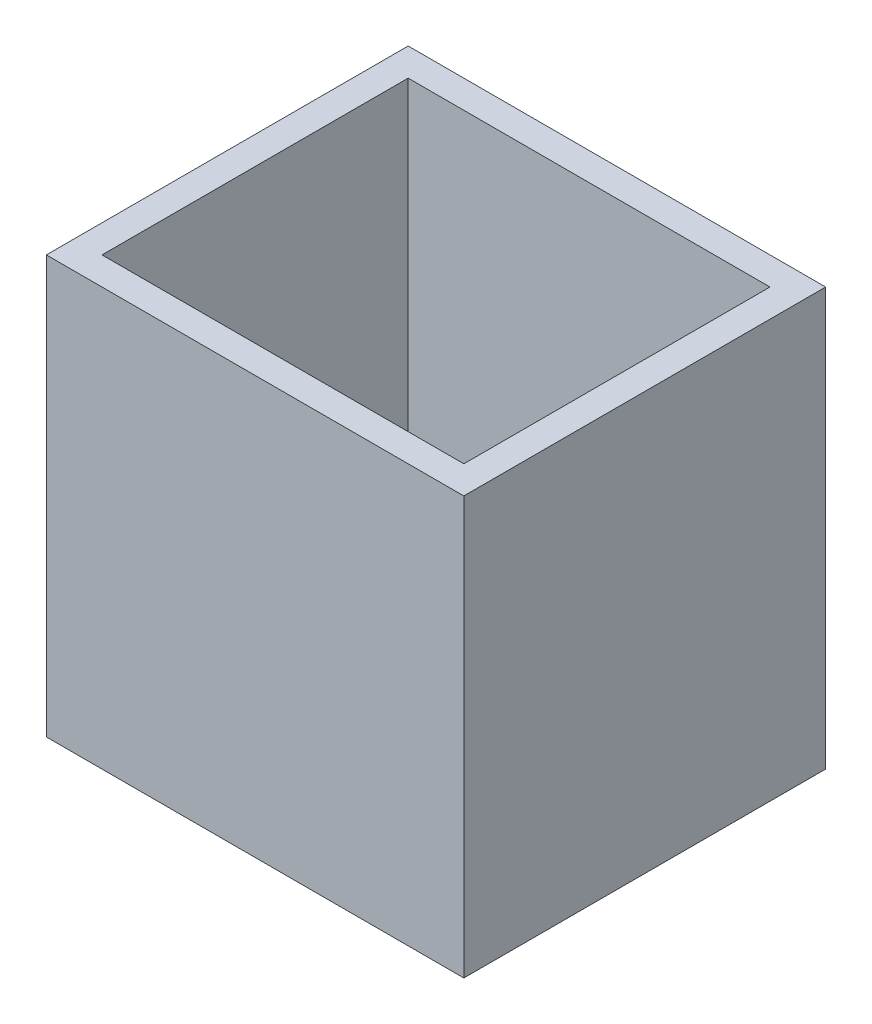
ISO-10303-21;
HEADER;
FILE_DESCRIPTION(('STEP AP214'),'2;1');
FILE_NAME('part.step','',(''),(''),'','','');
FILE_SCHEMA(('AUTOMOTIVE_DESIGN { 1 0 10303 214 1 1 1 1 }'));
ENDSEC;
DATA;
#1=APPLICATION_CONTEXT('core data for automotive mechanical design processes');
#2=APPLICATION_PROTOCOL_DEFINITION('international standard','automotive_design',2000,#1);
#3=PRODUCT_CONTEXT('',#1,'mechanical');
#4=PRODUCT('Part','Part','',(#3));
#5=PRODUCT_RELATED_PRODUCT_CATEGORY('part','',(#4));
#6=PRODUCT_DEFINITION_FORMATION('','',#4);
#7=PRODUCT_DEFINITION_CONTEXT('part definition',#1,'design');
#8=PRODUCT_DEFINITION('design','',#6,#7);
#9=PRODUCT_DEFINITION_SHAPE('','',#8);
#10=(LENGTH_UNIT() NAMED_UNIT(*) SI_UNIT(.MILLI.,.METRE.));
#11=(NAMED_UNIT(*) PLANE_ANGLE_UNIT() SI_UNIT($,.RADIAN.));
#12=(NAMED_UNIT(*) SI_UNIT($,.STERADIAN.) SOLID_ANGLE_UNIT());
#13=UNCERTAINTY_MEASURE_WITH_UNIT(LENGTH_MEASURE(1.E-05),#10,'distance_accuracy_value','');
#14=(GEOMETRIC_REPRESENTATION_CONTEXT(3) GLOBAL_UNCERTAINTY_ASSIGNED_CONTEXT((#13)) GLOBAL_UNIT_ASSIGNED_CONTEXT((#10,
#11,#12)) REPRESENTATION_CONTEXT('',''));
#15=CARTESIAN_POINT('',(0.,0.,0.));
#16=DIRECTION('',(0.,0.,1.));
#17=DIRECTION('',(1.,0.,0.));
#18=AXIS2_PLACEMENT_3D('',#15,#16,#17);
#19=CARTESIAN_POINT('',(0.,0.,130.));
#20=DIRECTION('',(1.,0.,0.));
#21=DIRECTION('',(0.,0.,-1.));
#22=AXIS2_PLACEMENT_3D('',#19,#20,#21);
#23=PLANE('',#22);
#24=DIRECTION('',(0.,-1.,0.));
#25=VECTOR('',#24,1.);
#26=CARTESIAN_POINT('',(0.,0.,0.));
#27=LINE('',#26,#25);
#28=CARTESIAN_POINT('',(0.,150.,0.));
#29=VERTEX_POINT('',#28);
#30=CARTESIAN_POINT('',(0.,0.,0.));
#31=VERTEX_POINT('',#30);
#32=EDGE_CURVE('E164',#29,#31,#27,.T.);
#33=ORIENTED_EDGE('',*,*,#32,.T.);
#34=DIRECTION('',(0.,0.,-1.));
#35=VECTOR('',#34,1.);
#36=CARTESIAN_POINT('',(0.,0.,130.));
#37=LINE('',#36,#35);
#38=CARTESIAN_POINT('',(0.,0.,130.));
#39=VERTEX_POINT('',#38);
#40=EDGE_CURVE('E11',#39,#31,#37,.T.);
#41=ORIENTED_EDGE('',*,*,#40,.F.);
#42=DIRECTION('',(0.,-1.,0.));
#43=VECTOR('',#42,1.);
#44=CARTESIAN_POINT('',(0.,0.,130.));
#45=LINE('',#44,#43);
#46=CARTESIAN_POINT('',(0.,150.,130.));
#47=VERTEX_POINT('',#46);
#48=EDGE_CURVE('E170',#47,#39,#45,.T.);
#49=ORIENTED_EDGE('',*,*,#48,.F.);
#50=DIRECTION('',(0.,0.,-1.));
#51=VECTOR('',#50,1.);
#52=CARTESIAN_POINT('',(0.,150.,130.));
#53=LINE('',#52,#51);
#54=EDGE_CURVE('E180',#47,#29,#53,.T.);
#55=ORIENTED_EDGE('',*,*,#54,.T.);
#56=EDGE_LOOP('',(#33,#41,#49,#55));
#57=FACE_BOUND('',#56,.T.);
#58=ADVANCED_FACE('F45',(#57),#23,.F.);
#59=CARTESIAN_POINT('',(0.,0.,130.));
#60=DIRECTION('',(0.,1.,0.));
#61=DIRECTION('',(0.,0.,1.));
#62=AXIS2_PLACEMENT_3D('',#59,#60,#61);
#63=PLANE('',#62);
#64=DIRECTION('',(1.,0.,0.));
#65=VECTOR('',#64,1.);
#66=CARTESIAN_POINT('',(0.,0.,0.));
#67=LINE('',#66,#65);
#68=CARTESIAN_POINT('',(150.,0.,0.));
#69=VERTEX_POINT('',#68);
#70=EDGE_CURVE('E184',#31,#69,#67,.T.);
#71=ORIENTED_EDGE('',*,*,#70,.T.);
#72=DIRECTION('',(0.,0.,-1.));
#73=VECTOR('',#72,1.);
#74=CARTESIAN_POINT('',(150.,0.,130.));
#75=LINE('',#74,#73);
#76=CARTESIAN_POINT('',(150.,0.,130.));
#77=VERTEX_POINT('',#76);
#78=EDGE_CURVE('E53',#77,#69,#75,.T.);
#79=ORIENTED_EDGE('',*,*,#78,.F.);
#80=DIRECTION('',(1.,0.,0.));
#81=VECTOR('',#80,1.);
#82=CARTESIAN_POINT('',(0.,0.,130.));
#83=LINE('',#82,#81);
#84=EDGE_CURVE('E97',#39,#77,#83,.T.);
#85=ORIENTED_EDGE('',*,*,#84,.F.);
#86=ORIENTED_EDGE('',*,*,#40,.T.);
#87=EDGE_LOOP('',(#71,#79,#85,#86));
#88=FACE_BOUND('',#87,.T.);
#89=ADVANCED_FACE('F221',(#88),#63,.F.);
#90=CARTESIAN_POINT('',(150.,0.,130.));
#91=DIRECTION('',(-1.,0.,0.));
#92=DIRECTION('',(0.,0.,1.));
#93=AXIS2_PLACEMENT_3D('',#90,#91,#92);
#94=PLANE('',#93);
#95=DIRECTION('',(0.,1.,0.));
#96=VECTOR('',#95,1.);
#97=CARTESIAN_POINT('',(150.,0.,0.));
#98=LINE('',#97,#96);
#99=CARTESIAN_POINT('',(150.,150.,0.));
#100=VERTEX_POINT('',#99);
#101=EDGE_CURVE('E187',#69,#100,#98,.T.);
#102=ORIENTED_EDGE('',*,*,#101,.T.);
#103=DIRECTION('',(0.,0.,-1.));
#104=VECTOR('',#103,1.);
#105=CARTESIAN_POINT('',(150.,150.,130.));
#106=LINE('',#105,#104);
#107=CARTESIAN_POINT('',(150.,150.,130.));
#108=VERTEX_POINT('',#107);
#109=EDGE_CURVE('E194',#108,#100,#106,.T.);
#110=ORIENTED_EDGE('',*,*,#109,.F.);
#111=DIRECTION('',(0.,1.,0.));
#112=VECTOR('',#111,1.);
#113=CARTESIAN_POINT('',(150.,0.,130.));
#114=LINE('',#113,#112);
#115=EDGE_CURVE('E175',#77,#108,#114,.T.);
#116=ORIENTED_EDGE('',*,*,#115,.F.);
#117=ORIENTED_EDGE('',*,*,#78,.T.);
#118=EDGE_LOOP('',(#102,#110,#116,#117));
#119=FACE_BOUND('',#118,.T.);
#120=ADVANCED_FACE('F201',(#119),#94,.F.);
#121=CARTESIAN_POINT('',(0.,150.,130.));
#122=DIRECTION('',(0.,-1.,0.));
#123=DIRECTION('',(0.,0.,-1.));
#124=AXIS2_PLACEMENT_3D('',#121,#122,#123);
#125=PLANE('',#124);
#126=DIRECTION('',(-1.,0.,0.));
#127=VECTOR('',#126,1.);
#128=CARTESIAN_POINT('',(140.,150.,10.));
#129=LINE('',#128,#127);
#130=CARTESIAN_POINT('',(140.,150.,9.99999999999999));
#131=VERTEX_POINT('',#130);
#132=CARTESIAN_POINT('',(10.,150.,10.));
#133=VERTEX_POINT('',#132);
#134=EDGE_CURVE('E155',#131,#133,#129,.T.);
#135=ORIENTED_EDGE('',*,*,#134,.F.);
#136=DIRECTION('',(0.,0.,-1.));
#137=VECTOR('',#136,1.);
#138=CARTESIAN_POINT('',(140.,150.,120.));
#139=LINE('',#138,#137);
#140=CARTESIAN_POINT('',(140.,150.,120.));
#141=VERTEX_POINT('',#140);
#142=EDGE_CURVE('E60',#141,#131,#139,.T.);
#143=ORIENTED_EDGE('',*,*,#142,.F.);
#144=DIRECTION('',(1.,0.,0.));
#145=VECTOR('',#144,1.);
#146=CARTESIAN_POINT('',(10.,150.,120.));
#147=LINE('',#146,#145);
#148=CARTESIAN_POINT('',(10.,150.,120.));
#149=VERTEX_POINT('',#148);
#150=EDGE_CURVE('E142',#149,#141,#147,.T.);
#151=ORIENTED_EDGE('',*,*,#150,.F.);
#152=DIRECTION('',(0.,0.,1.));
#153=VECTOR('',#152,1.);
#154=CARTESIAN_POINT('',(10.,150.,10.));
#155=LINE('',#154,#153);
#156=EDGE_CURVE('E146',#133,#149,#155,.T.);
#157=ORIENTED_EDGE('',*,*,#156,.F.);
#158=EDGE_LOOP('',(#135,#143,#151,#157));
#159=FACE_BOUND('',#158,.T.);
#160=DIRECTION('',(-1.,0.,0.));
#161=VECTOR('',#160,1.);
#162=CARTESIAN_POINT('',(0.,150.,0.));
#163=LINE('',#162,#161);
#164=EDGE_CURVE('E90',#100,#29,#163,.T.);
#165=ORIENTED_EDGE('',*,*,#164,.T.);
#166=ORIENTED_EDGE('',*,*,#54,.F.);
#167=DIRECTION('',(-1.,0.,0.));
#168=VECTOR('',#167,1.);
#169=CARTESIAN_POINT('',(0.,150.,130.));
#170=LINE('',#169,#168);
#171=EDGE_CURVE('E69',#108,#47,#170,.T.);
#172=ORIENTED_EDGE('',*,*,#171,.F.);
#173=ORIENTED_EDGE('',*,*,#109,.T.);
#174=EDGE_LOOP('',(#165,#166,#172,#173));
#175=FACE_BOUND('',#174,.T.);
#176=ADVANCED_FACE('F209',(#159,#175),#125,.F.);
#177=CARTESIAN_POINT('',(0.,0.,130.));
#178=DIRECTION('',(0.,0.,-1.));
#179=DIRECTION('',(-1.,0.,0.));
#180=AXIS2_PLACEMENT_3D('',#177,#178,#179);
#181=PLANE('',#180);
#182=ORIENTED_EDGE('',*,*,#48,.T.);
#183=ORIENTED_EDGE('',*,*,#84,.T.);
#184=ORIENTED_EDGE('',*,*,#115,.T.);
#185=ORIENTED_EDGE('',*,*,#171,.T.);
#186=EDGE_LOOP('',(#182,#183,#184,#185));
#187=FACE_BOUND('',#186,.T.);
#188=ADVANCED_FACE('F211',(#187),#181,.F.);
#189=CARTESIAN_POINT('',(0.,0.,0.));
#190=DIRECTION('',(0.,0.,-1.));
#191=DIRECTION('',(-1.,0.,0.));
#192=AXIS2_PLACEMENT_3D('',#189,#190,#191);
#193=PLANE('',#192);
#194=ORIENTED_EDGE('',*,*,#32,.F.);
#195=ORIENTED_EDGE('',*,*,#164,.F.);
#196=ORIENTED_EDGE('',*,*,#101,.F.);
#197=ORIENTED_EDGE('',*,*,#70,.F.);
#198=EDGE_LOOP('',(#194,#195,#196,#197));
#199=FACE_BOUND('',#198,.T.);
#200=ADVANCED_FACE('F205',(#199),#193,.T.);
#201=CARTESIAN_POINT('',(140.,40.,120.));
#202=DIRECTION('',(1.,0.,0.));
#203=DIRECTION('',(0.,0.,-1.));
#204=AXIS2_PLACEMENT_3D('',#201,#202,#203);
#205=PLANE('',#204);
#206=ORIENTED_EDGE('',*,*,#142,.T.);
#207=DIRECTION('',(0.,1.,0.));
#208=VECTOR('',#207,1.);
#209=CARTESIAN_POINT('',(140.,40.,10.));
#210=LINE('',#209,#208);
#211=CARTESIAN_POINT('',(140.,40.,10.));
#212=VERTEX_POINT('',#211);
#213=EDGE_CURVE('E117',#212,#131,#210,.T.);
#214=ORIENTED_EDGE('',*,*,#213,.F.);
#215=DIRECTION('',(0.,0.,-1.));
#216=VECTOR('',#215,1.);
#217=CARTESIAN_POINT('',(140.,40.,120.));
#218=LINE('',#217,#216);
#219=CARTESIAN_POINT('',(140.,40.,120.));
#220=VERTEX_POINT('',#219);
#221=EDGE_CURVE('E121',#220,#212,#218,.T.);
#222=ORIENTED_EDGE('',*,*,#221,.F.);
#223=DIRECTION('',(0.,1.,0.));
#224=VECTOR('',#223,1.);
#225=CARTESIAN_POINT('',(140.,40.,120.));
#226=LINE('',#225,#224);
#227=EDGE_CURVE('E161',#220,#141,#226,.T.);
#228=ORIENTED_EDGE('',*,*,#227,.T.);
#229=EDGE_LOOP('',(#206,#214,#222,#228));
#230=FACE_BOUND('',#229,.T.);
#231=ADVANCED_FACE('F119',(#230),#205,.F.);
#232=CARTESIAN_POINT('',(10.,40.,120.));
#233=DIRECTION('',(0.,0.,1.));
#234=DIRECTION('',(1.,0.,0.));
#235=AXIS2_PLACEMENT_3D('',#232,#233,#234);
#236=PLANE('',#235);
#237=ORIENTED_EDGE('',*,*,#150,.T.);
#238=ORIENTED_EDGE('',*,*,#227,.F.);
#239=DIRECTION('',(1.,0.,0.));
#240=VECTOR('',#239,1.);
#241=CARTESIAN_POINT('',(10.,40.,120.));
#242=LINE('',#241,#240);
#243=CARTESIAN_POINT('',(10.,40.,120.));
#244=VERTEX_POINT('',#243);
#245=EDGE_CURVE('E128',#244,#220,#242,.T.);
#246=ORIENTED_EDGE('',*,*,#245,.F.);
#247=DIRECTION('',(0.,1.,0.));
#248=VECTOR('',#247,1.);
#249=CARTESIAN_POINT('',(10.,40.,120.));
#250=LINE('',#249,#248);
#251=EDGE_CURVE('E165',#244,#149,#250,.T.);
#252=ORIENTED_EDGE('',*,*,#251,.T.);
#253=EDGE_LOOP('',(#237,#238,#246,#252));
#254=FACE_BOUND('',#253,.T.);
#255=ADVANCED_FACE('F254',(#254),#236,.F.);
#256=CARTESIAN_POINT('',(10.,40.,10.));
#257=DIRECTION('',(-1.,0.,0.));
#258=DIRECTION('',(0.,0.,1.));
#259=AXIS2_PLACEMENT_3D('',#256,#257,#258);
#260=PLANE('',#259);
#261=ORIENTED_EDGE('',*,*,#156,.T.);
#262=ORIENTED_EDGE('',*,*,#251,.F.);
#263=DIRECTION('',(0.,0.,1.));
#264=VECTOR('',#263,1.);
#265=CARTESIAN_POINT('',(10.,40.,10.));
#266=LINE('',#265,#264);
#267=CARTESIAN_POINT('',(10.,40.,10.));
#268=VERTEX_POINT('',#267);
#269=EDGE_CURVE('E137',#268,#244,#266,.T.);
#270=ORIENTED_EDGE('',*,*,#269,.F.);
#271=DIRECTION('',(0.,1.,0.));
#272=VECTOR('',#271,1.);
#273=CARTESIAN_POINT('',(10.,40.,10.));
#274=LINE('',#273,#272);
#275=EDGE_CURVE('E127',#268,#133,#274,.T.);
#276=ORIENTED_EDGE('',*,*,#275,.T.);
#277=EDGE_LOOP('',(#261,#262,#270,#276));
#278=FACE_BOUND('',#277,.T.);
#279=ADVANCED_FACE('F263',(#278),#260,.F.);
#280=CARTESIAN_POINT('',(140.,40.,10.));
#281=DIRECTION('',(0.,0.,-1.));
#282=DIRECTION('',(-1.,0.,0.));
#283=AXIS2_PLACEMENT_3D('',#280,#281,#282);
#284=PLANE('',#283);
#285=ORIENTED_EDGE('',*,*,#134,.T.);
#286=ORIENTED_EDGE('',*,*,#275,.F.);
#287=DIRECTION('',(-1.,0.,0.));
#288=VECTOR('',#287,1.);
#289=CARTESIAN_POINT('',(140.,40.,10.));
#290=LINE('',#289,#288);
#291=EDGE_CURVE('E131',#212,#268,#290,.T.);
#292=ORIENTED_EDGE('',*,*,#291,.F.);
#293=ORIENTED_EDGE('',*,*,#213,.T.);
#294=EDGE_LOOP('',(#285,#286,#292,#293));
#295=FACE_BOUND('',#294,.T.);
#296=ADVANCED_FACE('F132',(#295),#284,.F.);
#297=CARTESIAN_POINT('',(0.,40.,0.));
#298=DIRECTION('',(0.,1.,0.));
#299=DIRECTION('',(0.,0.,1.));
#300=AXIS2_PLACEMENT_3D('',#297,#298,#299);
#301=PLANE('',#300);
#302=ORIENTED_EDGE('',*,*,#221,.T.);
#303=ORIENTED_EDGE('',*,*,#291,.T.);
#304=ORIENTED_EDGE('',*,*,#269,.T.);
#305=ORIENTED_EDGE('',*,*,#245,.T.);
#306=EDGE_LOOP('',(#302,#303,#304,#305));
#307=FACE_BOUND('',#306,.T.);
#308=ADVANCED_FACE('F139',(#307),#301,.T.);
#309=CLOSED_SHELL('',(#58,#89,#120,#176,#188,#200,#231,#255,#279,#296,#308));
#310=MANIFOLD_SOLID_BREP('B2',#309);
#311=ADVANCED_BREP_SHAPE_REPRESENTATION('',(#18,#310),#14);
#312=SHAPE_DEFINITION_REPRESENTATION(#9,#311);
ENDSEC;
END-ISO-10303-21;
